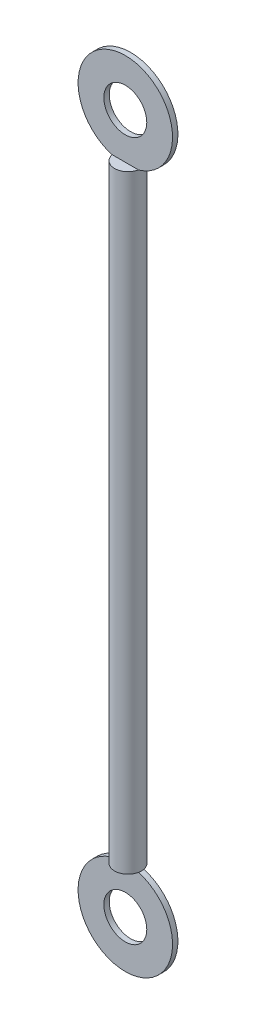
ISO-10303-21;
HEADER;
FILE_DESCRIPTION(('STEP AP214'),'2;1');
FILE_NAME('part.step','',(''),(''),'','','');
FILE_SCHEMA(('AUTOMOTIVE_DESIGN { 1 0 10303 214 1 1 1 1 }'));
ENDSEC;
DATA;
#1=APPLICATION_CONTEXT('core data for automotive mechanical design processes');
#2=APPLICATION_PROTOCOL_DEFINITION('international standard','automotive_design',2000,#1);
#3=PRODUCT_CONTEXT('',#1,'mechanical');
#4=PRODUCT('Part','Part','',(#3));
#5=PRODUCT_RELATED_PRODUCT_CATEGORY('part','',(#4));
#6=PRODUCT_DEFINITION_FORMATION('','',#4);
#7=PRODUCT_DEFINITION_CONTEXT('part definition',#1,'design');
#8=PRODUCT_DEFINITION('design','',#6,#7);
#9=PRODUCT_DEFINITION_SHAPE('','',#8);
#10=(LENGTH_UNIT() NAMED_UNIT(*) SI_UNIT(.MILLI.,.METRE.));
#11=(NAMED_UNIT(*) PLANE_ANGLE_UNIT() SI_UNIT($,.RADIAN.));
#12=(NAMED_UNIT(*) SI_UNIT($,.STERADIAN.) SOLID_ANGLE_UNIT());
#13=UNCERTAINTY_MEASURE_WITH_UNIT(LENGTH_MEASURE(1.E-05),#10,'distance_accuracy_value','');
#14=(GEOMETRIC_REPRESENTATION_CONTEXT(3) GLOBAL_UNCERTAINTY_ASSIGNED_CONTEXT((#13)) GLOBAL_UNIT_ASSIGNED_CONTEXT((#10,
#11,#12)) REPRESENTATION_CONTEXT('',''));
#15=CARTESIAN_POINT('',(0.,0.,0.));
#16=DIRECTION('',(0.,0.,1.));
#17=DIRECTION('',(1.,0.,0.));
#18=AXIS2_PLACEMENT_3D('',#15,#16,#17);
#19=CARTESIAN_POINT('',(0.,296.80693739286,0.));
#20=DIRECTION('',(0.,1.,0.));
#21=DIRECTION('',(-1.,0.,0.));
#22=AXIS2_PLACEMENT_3D('',#19,#20,#21);
#23=PLANE('',#22);
#24=CARTESIAN_POINT('',(0.,296.80693739286,0.));
#25=DIRECTION('',(0.,1.,0.));
#26=DIRECTION('',(-1.,0.,0.));
#27=AXIS2_PLACEMENT_3D('',#24,#25,#26);
#28=CIRCLE('',#27,3.96874999999997);
#29=CARTESIAN_POINT('',(3.88856496666831,296.80693739286,-0.79375));
#30=VERTEX_POINT('',#29);
#31=CARTESIAN_POINT('',(-3.88856496666822,296.80693739286,-0.79375));
#32=VERTEX_POINT('',#31);
#33=EDGE_CURVE('E193',#30,#32,#28,.T.);
#34=ORIENTED_EDGE('',*,*,#33,.T.);
#35=DIRECTION('',(1.,0.,0.));
#36=VECTOR('',#35,1.);
#37=CARTESIAN_POINT('',(0.,296.80693739286,-0.79375));
#38=LINE('',#37,#36);
#39=EDGE_CURVE('E45',#32,#30,#38,.T.);
#40=ORIENTED_EDGE('',*,*,#39,.T.);
#41=EDGE_LOOP('',(#34,#40));
#42=FACE_BOUND('',#41,.T.);
#43=ADVANCED_FACE('F37',(#42),#23,.T.);
#44=CARTESIAN_POINT('',(0.,116.79484440786,0.));
#45=DIRECTION('',(0.,1.,0.));
#46=DIRECTION('',(-1.,0.,0.));
#47=AXIS2_PLACEMENT_3D('',#44,#45,#46);
#48=PLANE('',#47);
#49=DIRECTION('',(1.,0.,0.));
#50=VECTOR('',#49,1.);
#51=CARTESIAN_POINT('',(0.,116.79484440786,-0.79375));
#52=LINE('',#51,#50);
#53=CARTESIAN_POINT('',(-3.88856496666823,116.79484440786,-0.79375));
#54=VERTEX_POINT('',#53);
#55=CARTESIAN_POINT('',(3.88856496666831,116.79484440786,-0.79375));
#56=VERTEX_POINT('',#55);
#57=EDGE_CURVE('E172',#54,#56,#52,.T.);
#58=ORIENTED_EDGE('',*,*,#57,.F.);
#59=CARTESIAN_POINT('',(0.,116.79484440786,0.));
#60=DIRECTION('',(0.,1.,0.));
#61=DIRECTION('',(-1.,0.,0.));
#62=AXIS2_PLACEMENT_3D('',#59,#60,#61);
#63=CIRCLE('',#62,3.96874999999998);
#64=EDGE_CURVE('E271',#56,#54,#63,.T.);
#65=ORIENTED_EDGE('',*,*,#64,.F.);
#66=EDGE_LOOP('',(#58,#65));
#67=FACE_BOUND('',#66,.T.);
#68=ADVANCED_FACE('F222',(#67),#48,.F.);
#69=CARTESIAN_POINT('',(-3.88856496666823,116.79484440786,0.79375));
#70=VERTEX_POINT('',#69);
#71=CARTESIAN_POINT('',(3.88856496666831,116.79484440786,0.79375));
#72=VERTEX_POINT('',#71);
#73=EDGE_CURVE('E188',#70,#72,#63,.T.);
#74=ORIENTED_EDGE('',*,*,#73,.F.);
#75=DIRECTION('',(1.,0.,0.));
#76=VECTOR('',#75,1.);
#77=CARTESIAN_POINT('',(0.,116.79484440786,0.79375));
#78=LINE('',#77,#76);
#79=EDGE_CURVE('E162',#70,#72,#78,.T.);
#80=ORIENTED_EDGE('',*,*,#79,.T.);
#81=EDGE_LOOP('',(#74,#80));
#82=FACE_BOUND('',#81,.T.);
#83=ADVANCED_FACE('F39',(#82),#48,.F.);
#84=CARTESIAN_POINT('',(0.,296.80693739286,0.));
#85=DIRECTION('',(0.,1.,0.));
#86=DIRECTION('',(-1.,0.,0.));
#87=AXIS2_PLACEMENT_3D('',#84,#85,#86);
#88=CYLINDRICAL_SURFACE('',#87,3.96874999999998);
#89=CARTESIAN_POINT('',(-3.96874999999998,296.80693739286,0.));
#90=VERTEX_POINT('',#89);
#91=CARTESIAN_POINT('',(-3.88856496666822,296.80693739286,0.79375));
#92=VERTEX_POINT('',#91);
#93=EDGE_CURVE('E131',#90,#92,#28,.T.);
#94=ORIENTED_EDGE('',*,*,#93,.F.);
#95=EDGE_CURVE('E182',#32,#90,#28,.T.);
#96=ORIENTED_EDGE('',*,*,#95,.F.);
#97=ORIENTED_EDGE('',*,*,#33,.F.);
#98=CARTESIAN_POINT('',(3.96875000000002,296.80693739286,0.));
#99=VERTEX_POINT('',#98);
#100=EDGE_CURVE('E201',#99,#30,#28,.T.);
#101=ORIENTED_EDGE('',*,*,#100,.F.);
#102=CARTESIAN_POINT('',(3.88856496666831,296.80693739286,0.79375));
#103=VERTEX_POINT('',#102);
#104=EDGE_CURVE('E202',#103,#99,#28,.T.);
#105=ORIENTED_EDGE('',*,*,#104,.F.);
#106=EDGE_CURVE('E185',#92,#103,#28,.T.);
#107=ORIENTED_EDGE('',*,*,#106,.F.);
#108=EDGE_LOOP('',(#94,#96,#97,#101,#105,#107));
#109=FACE_BOUND('',#108,.T.);
#110=CARTESIAN_POINT('',(-3.96874999999998,116.79484440786,0.));
#111=VERTEX_POINT('',#110);
#112=EDGE_CURVE('E186',#111,#70,#63,.T.);
#113=ORIENTED_EDGE('',*,*,#112,.T.);
#114=ORIENTED_EDGE('',*,*,#73,.T.);
#115=CARTESIAN_POINT('',(3.96875000000002,116.79484440786,0.));
#116=VERTEX_POINT('',#115);
#117=EDGE_CURVE('E253',#72,#116,#63,.T.);
#118=ORIENTED_EDGE('',*,*,#117,.T.);
#119=EDGE_CURVE('E270',#116,#56,#63,.T.);
#120=ORIENTED_EDGE('',*,*,#119,.T.);
#121=ORIENTED_EDGE('',*,*,#64,.T.);
#122=EDGE_CURVE('E184',#54,#111,#63,.T.);
#123=ORIENTED_EDGE('',*,*,#122,.T.);
#124=EDGE_LOOP('',(#113,#114,#118,#120,#121,#123));
#125=FACE_BOUND('',#124,.T.);
#126=ADVANCED_FACE('F198',(#109,#125),#88,.T.);
#127=DIRECTION('',(1.,0.,0.));
#128=VECTOR('',#127,1.);
#129=CARTESIAN_POINT('',(0.,296.80693739286,0.79375));
#130=LINE('',#129,#128);
#131=EDGE_CURVE('E11',#92,#103,#130,.T.);
#132=ORIENTED_EDGE('',*,*,#131,.F.);
#133=ORIENTED_EDGE('',*,*,#106,.T.);
#134=EDGE_LOOP('',(#132,#133));
#135=FACE_BOUND('',#134,.T.);
#136=ADVANCED_FACE('F224',(#135),#23,.T.);
#137=CARTESIAN_POINT('',(0.,116.79484440786,0.79375));
#138=DIRECTION('',(0.,1.,0.));
#139=DIRECTION('',(0.,0.,1.));
#140=AXIS2_PLACEMENT_3D('',#137,#138,#139);
#141=PLANE('',#140);
#142=ORIENTED_EDGE('',*,*,#117,.F.);
#143=CARTESIAN_POINT('',(3.96875000000002,116.79484440786,0.79375));
#144=VERTEX_POINT('',#143);
#145=EDGE_CURVE('E158',#72,#144,#78,.T.);
#146=ORIENTED_EDGE('',*,*,#145,.T.);
#147=DIRECTION('',(0.,0.,-1.));
#148=VECTOR('',#147,1.);
#149=CARTESIAN_POINT('',(3.96875000000002,116.79484440786,0.79375));
#150=LINE('',#149,#148);
#151=EDGE_CURVE('E175',#144,#116,#150,.T.);
#152=ORIENTED_EDGE('',*,*,#151,.T.);
#153=EDGE_LOOP('',(#142,#146,#152));
#154=FACE_BOUND('',#153,.T.);
#155=ADVANCED_FACE('F231',(#154),#141,.T.);
#156=ORIENTED_EDGE('',*,*,#119,.F.);
#157=CARTESIAN_POINT('',(3.96875000000002,116.79484440786,-0.79375));
#158=VERTEX_POINT('',#157);
#159=EDGE_CURVE('E165',#116,#158,#150,.T.);
#160=ORIENTED_EDGE('',*,*,#159,.T.);
#161=EDGE_CURVE('E168',#56,#158,#52,.T.);
#162=ORIENTED_EDGE('',*,*,#161,.F.);
#163=EDGE_LOOP('',(#156,#160,#162));
#164=FACE_BOUND('',#163,.T.);
#165=ADVANCED_FACE('F237',(#164),#141,.T.);
#166=ORIENTED_EDGE('',*,*,#122,.F.);
#167=CARTESIAN_POINT('',(-3.96874999999998,116.79484440786,-0.79375));
#168=VERTEX_POINT('',#167);
#169=EDGE_CURVE('E169',#168,#54,#52,.T.);
#170=ORIENTED_EDGE('',*,*,#169,.F.);
#171=DIRECTION('',(0.,0.,-1.));
#172=VECTOR('',#171,1.);
#173=CARTESIAN_POINT('',(-3.96874999999998,116.79484440786,0.79375));
#174=LINE('',#173,#172);
#175=EDGE_CURVE('E178',#111,#168,#174,.T.);
#176=ORIENTED_EDGE('',*,*,#175,.F.);
#177=EDGE_LOOP('',(#166,#170,#176));
#178=FACE_BOUND('',#177,.T.);
#179=ADVANCED_FACE('F260',(#178),#141,.T.);
#180=ORIENTED_EDGE('',*,*,#112,.F.);
#181=CARTESIAN_POINT('',(-3.96874999999998,116.79484440786,0.79375));
#182=VERTEX_POINT('',#181);
#183=EDGE_CURVE('E179',#182,#111,#174,.T.);
#184=ORIENTED_EDGE('',*,*,#183,.F.);
#185=EDGE_CURVE('E60',#182,#70,#78,.T.);
#186=ORIENTED_EDGE('',*,*,#185,.T.);
#187=EDGE_LOOP('',(#180,#184,#186));
#188=FACE_BOUND('',#187,.T.);
#189=ADVANCED_FACE('F240',(#188),#141,.T.);
#190=CARTESIAN_POINT('',(0.,103.40044545018,0.79375));
#191=DIRECTION('',(0.,0.,-1.));
#192=DIRECTION('',(-1.,0.,0.));
#193=AXIS2_PLACEMENT_3D('',#190,#191,#192);
#194=CYLINDRICAL_SURFACE('',#193,6.35);
#195=CARTESIAN_POINT('',(0.,103.40044545018,0.79375));
#196=DIRECTION('',(0.,0.,1.));
#197=DIRECTION('',(1.,0.,0.));
#198=AXIS2_PLACEMENT_3D('',#195,#196,#197);
#199=CIRCLE('',#198,6.35);
#200=CARTESIAN_POINT('',(6.35000000000002,103.40044545018,0.79375));
#201=VERTEX_POINT('',#200);
#202=EDGE_CURVE('E155',#201,#201,#199,.T.);
#203=ORIENTED_EDGE('',*,*,#202,.T.);
#204=EDGE_LOOP('',(#203));
#205=FACE_BOUND('',#204,.T.);
#206=CARTESIAN_POINT('',(0.,103.40044545018,-0.79375));
#207=DIRECTION('',(0.,0.,1.));
#208=DIRECTION('',(1.,0.,0.));
#209=AXIS2_PLACEMENT_3D('',#206,#207,#208);
#210=CIRCLE('',#209,6.35);
#211=CARTESIAN_POINT('',(6.35000000000002,103.40044545018,-0.79375));
#212=VERTEX_POINT('',#211);
#213=EDGE_CURVE('E126',#212,#212,#210,.T.);
#214=ORIENTED_EDGE('',*,*,#213,.F.);
#215=EDGE_LOOP('',(#214));
#216=FACE_BOUND('',#215,.T.);
#217=ADVANCED_FACE('F284',(#205,#216),#194,.F.);
#218=CARTESIAN_POINT('',(0.,103.40044545018,0.79375));
#219=DIRECTION('',(0.,0.,-1.));
#220=DIRECTION('',(-1.,0.,0.));
#221=AXIS2_PLACEMENT_3D('',#218,#219,#220);
#222=CYLINDRICAL_SURFACE('',#221,13.97);
#223=CARTESIAN_POINT('',(0.,103.40044545018,-0.79375));
#224=DIRECTION('',(0.,0.,1.));
#225=DIRECTION('',(1.,0.,0.));
#226=AXIS2_PLACEMENT_3D('',#223,#224,#225);
#227=CIRCLE('',#226,13.97);
#228=EDGE_CURVE('E159',#168,#158,#227,.T.);
#229=ORIENTED_EDGE('',*,*,#228,.T.);
#230=ORIENTED_EDGE('',*,*,#159,.F.);
#231=ORIENTED_EDGE('',*,*,#151,.F.);
#232=CARTESIAN_POINT('',(0.,103.40044545018,0.79375));
#233=DIRECTION('',(0.,0.,1.));
#234=DIRECTION('',(1.,0.,0.));
#235=AXIS2_PLACEMENT_3D('',#232,#233,#234);
#236=CIRCLE('',#235,13.97);
#237=EDGE_CURVE('E161',#182,#144,#236,.T.);
#238=ORIENTED_EDGE('',*,*,#237,.F.);
#239=ORIENTED_EDGE('',*,*,#183,.T.);
#240=ORIENTED_EDGE('',*,*,#175,.T.);
#241=EDGE_LOOP('',(#229,#230,#231,#238,#239,#240));
#242=FACE_BOUND('',#241,.T.);
#243=ADVANCED_FACE('F263',(#242),#222,.T.);
#244=CARTESIAN_POINT('',(0.,103.40044545018,0.79375));
#245=DIRECTION('',(0.,0.,1.));
#246=DIRECTION('',(1.,0.,0.));
#247=AXIS2_PLACEMENT_3D('',#244,#245,#246);
#248=PLANE('',#247);
#249=ORIENTED_EDGE('',*,*,#202,.F.);
#250=EDGE_LOOP('',(#249));
#251=FACE_BOUND('',#250,.T.);
#252=ORIENTED_EDGE('',*,*,#185,.F.);
#253=ORIENTED_EDGE('',*,*,#237,.T.);
#254=ORIENTED_EDGE('',*,*,#145,.F.);
#255=ORIENTED_EDGE('',*,*,#79,.F.);
#256=EDGE_LOOP('',(#252,#253,#254,#255));
#257=FACE_BOUND('',#256,.T.);
#258=ADVANCED_FACE('F268',(#251,#257),#248,.T.);
#259=CARTESIAN_POINT('',(0.,103.40044545018,-0.79375));
#260=DIRECTION('',(0.,0.,1.));
#261=DIRECTION('',(1.,0.,0.));
#262=AXIS2_PLACEMENT_3D('',#259,#260,#261);
#263=PLANE('',#262);
#264=ORIENTED_EDGE('',*,*,#213,.T.);
#265=EDGE_LOOP('',(#264));
#266=FACE_BOUND('',#265,.T.);
#267=ORIENTED_EDGE('',*,*,#169,.T.);
#268=ORIENTED_EDGE('',*,*,#57,.T.);
#269=ORIENTED_EDGE('',*,*,#161,.T.);
#270=ORIENTED_EDGE('',*,*,#228,.F.);
#271=EDGE_LOOP('',(#267,#268,#269,#270));
#272=FACE_BOUND('',#271,.T.);
#273=ADVANCED_FACE('F217',(#266,#272),#263,.F.);
#274=CARTESIAN_POINT('',(0.,296.80693739286,0.79375));
#275=DIRECTION('',(0.,1.,0.));
#276=DIRECTION('',(0.,0.,1.));
#277=AXIS2_PLACEMENT_3D('',#274,#275,#276);
#278=PLANE('',#277);
#279=DIRECTION('',(1.,0.,0.));
#280=VECTOR('',#279,1.);
#281=CARTESIAN_POINT('',(0.,296.80693739286,0.79375));
#282=LINE('',#281,#280);
#283=CARTESIAN_POINT('',(3.96875000000002,296.80693739286,0.79375));
#284=VERTEX_POINT('',#283);
#285=EDGE_CURVE('E135',#103,#284,#282,.T.);
#286=ORIENTED_EDGE('',*,*,#285,.F.);
#287=ORIENTED_EDGE('',*,*,#104,.T.);
#288=DIRECTION('',(0.,0.,-1.));
#289=VECTOR('',#288,1.);
#290=CARTESIAN_POINT('',(3.96875000000002,296.80693739286,0.79375));
#291=LINE('',#290,#289);
#292=EDGE_CURVE('E153',#284,#99,#291,.T.);
#293=ORIENTED_EDGE('',*,*,#292,.F.);
#294=EDGE_LOOP('',(#286,#287,#293));
#295=FACE_BOUND('',#294,.T.);
#296=ADVANCED_FACE('F211',(#295),#278,.F.);
#297=CARTESIAN_POINT('',(3.96875000000002,296.80693739286,-0.79375));
#298=VERTEX_POINT('',#297);
#299=EDGE_CURVE('E148',#99,#298,#291,.T.);
#300=ORIENTED_EDGE('',*,*,#299,.F.);
#301=ORIENTED_EDGE('',*,*,#100,.T.);
#302=DIRECTION('',(1.,0.,0.));
#303=VECTOR('',#302,1.);
#304=CARTESIAN_POINT('',(0.,296.80693739286,-0.79375));
#305=LINE('',#304,#303);
#306=EDGE_CURVE('E52',#30,#298,#305,.T.);
#307=ORIENTED_EDGE('',*,*,#306,.T.);
#308=EDGE_LOOP('',(#300,#301,#307));
#309=FACE_BOUND('',#308,.T.);
#310=ADVANCED_FACE('F209',(#309),#278,.F.);
#311=CARTESIAN_POINT('',(-3.96874999999998,296.80693739286,-0.79375));
#312=VERTEX_POINT('',#311);
#313=EDGE_CURVE('E143',#312,#32,#305,.T.);
#314=ORIENTED_EDGE('',*,*,#313,.T.);
#315=ORIENTED_EDGE('',*,*,#95,.T.);
#316=DIRECTION('',(0.,0.,-1.));
#317=VECTOR('',#316,1.);
#318=CARTESIAN_POINT('',(-3.96874999999998,296.80693739286,0.79375));
#319=LINE('',#318,#317);
#320=EDGE_CURVE('E123',#90,#312,#319,.T.);
#321=ORIENTED_EDGE('',*,*,#320,.T.);
#322=EDGE_LOOP('',(#314,#315,#321));
#323=FACE_BOUND('',#322,.T.);
#324=ADVANCED_FACE('F204',(#323),#278,.F.);
#325=CARTESIAN_POINT('',(0.,310.20133635054,0.79375));
#326=DIRECTION('',(0.,0.,-1.));
#327=DIRECTION('',(-1.,0.,0.));
#328=AXIS2_PLACEMENT_3D('',#325,#326,#327);
#329=CYLINDRICAL_SURFACE('',#328,13.97);
#330=CARTESIAN_POINT('',(0.,310.20133635054,-0.79375));
#331=DIRECTION('',(0.,0.,1.));
#332=DIRECTION('',(1.,0.,0.));
#333=AXIS2_PLACEMENT_3D('',#330,#331,#332);
#334=CIRCLE('',#333,13.97);
#335=EDGE_CURVE('E149',#312,#298,#334,.F.);
#336=ORIENTED_EDGE('',*,*,#335,.F.);
#337=ORIENTED_EDGE('',*,*,#320,.F.);
#338=CARTESIAN_POINT('',(-3.96874999999998,296.80693739286,0.79375));
#339=VERTEX_POINT('',#338);
#340=EDGE_CURVE('E116',#339,#90,#319,.T.);
#341=ORIENTED_EDGE('',*,*,#340,.F.);
#342=CARTESIAN_POINT('',(0.,310.20133635054,0.79375));
#343=DIRECTION('',(0.,0.,1.));
#344=DIRECTION('',(1.,0.,0.));
#345=AXIS2_PLACEMENT_3D('',#342,#343,#344);
#346=CIRCLE('',#345,13.97);
#347=EDGE_CURVE('E122',#339,#284,#346,.F.);
#348=ORIENTED_EDGE('',*,*,#347,.T.);
#349=ORIENTED_EDGE('',*,*,#292,.T.);
#350=ORIENTED_EDGE('',*,*,#299,.T.);
#351=EDGE_LOOP('',(#336,#337,#341,#348,#349,#350));
#352=FACE_BOUND('',#351,.T.);
#353=ADVANCED_FACE('F119',(#352),#329,.T.);
#354=ORIENTED_EDGE('',*,*,#340,.T.);
#355=ORIENTED_EDGE('',*,*,#93,.T.);
#356=EDGE_CURVE('E129',#339,#92,#282,.T.);
#357=ORIENTED_EDGE('',*,*,#356,.F.);
#358=EDGE_LOOP('',(#354,#355,#357));
#359=FACE_BOUND('',#358,.T.);
#360=ADVANCED_FACE('F130',(#359),#278,.F.);
#361=CARTESIAN_POINT('',(0.,310.20133635054,0.79375));
#362=DIRECTION('',(0.,0.,-1.));
#363=DIRECTION('',(-1.,0.,0.));
#364=AXIS2_PLACEMENT_3D('',#361,#362,#363);
#365=CYLINDRICAL_SURFACE('',#364,6.35);
#366=CARTESIAN_POINT('',(0.,310.20133635054,0.79375));
#367=DIRECTION('',(0.,0.,1.));
#368=DIRECTION('',(1.,0.,0.));
#369=AXIS2_PLACEMENT_3D('',#366,#367,#368);
#370=CIRCLE('',#369,6.35);
#371=CARTESIAN_POINT('',(6.35000000000002,310.20133635054,0.79375));
#372=VERTEX_POINT('',#371);
#373=EDGE_CURVE('E134',#372,#372,#370,.F.);
#374=ORIENTED_EDGE('',*,*,#373,.F.);
#375=EDGE_LOOP('',(#374));
#376=FACE_BOUND('',#375,.T.);
#377=CARTESIAN_POINT('',(0.,310.20133635054,-0.79375));
#378=DIRECTION('',(0.,0.,1.));
#379=DIRECTION('',(1.,0.,0.));
#380=AXIS2_PLACEMENT_3D('',#377,#378,#379);
#381=CIRCLE('',#380,6.35);
#382=CARTESIAN_POINT('',(6.35000000000002,310.20133635054,-0.79375));
#383=VERTEX_POINT('',#382);
#384=EDGE_CURVE('E140',#383,#383,#381,.F.);
#385=ORIENTED_EDGE('',*,*,#384,.T.);
#386=EDGE_LOOP('',(#385));
#387=FACE_BOUND('',#386,.T.);
#388=ADVANCED_FACE('F305',(#376,#387),#365,.F.);
#389=CARTESIAN_POINT('',(0.,103.40044545018,0.79375));
#390=DIRECTION('',(0.,0.,1.));
#391=DIRECTION('',(1.,0.,0.));
#392=AXIS2_PLACEMENT_3D('',#389,#390,#391);
#393=PLANE('',#392);
#394=ORIENTED_EDGE('',*,*,#347,.F.);
#395=ORIENTED_EDGE('',*,*,#356,.T.);
#396=ORIENTED_EDGE('',*,*,#131,.T.);
#397=ORIENTED_EDGE('',*,*,#285,.T.);
#398=EDGE_LOOP('',(#394,#395,#396,#397));
#399=FACE_BOUND('',#398,.T.);
#400=ORIENTED_EDGE('',*,*,#373,.T.);
#401=EDGE_LOOP('',(#400));
#402=FACE_BOUND('',#401,.T.);
#403=ADVANCED_FACE('F137',(#399,#402),#393,.T.);
#404=CARTESIAN_POINT('',(0.,103.40044545018,-0.79375));
#405=DIRECTION('',(0.,0.,1.));
#406=DIRECTION('',(1.,0.,0.));
#407=AXIS2_PLACEMENT_3D('',#404,#405,#406);
#408=PLANE('',#407);
#409=ORIENTED_EDGE('',*,*,#335,.T.);
#410=ORIENTED_EDGE('',*,*,#306,.F.);
#411=ORIENTED_EDGE('',*,*,#39,.F.);
#412=ORIENTED_EDGE('',*,*,#313,.F.);
#413=EDGE_LOOP('',(#409,#410,#411,#412));
#414=FACE_BOUND('',#413,.T.);
#415=ORIENTED_EDGE('',*,*,#384,.F.);
#416=EDGE_LOOP('',(#415));
#417=FACE_BOUND('',#416,.T.);
#418=ADVANCED_FACE('F205',(#414,#417),#408,.F.);
#419=CLOSED_SHELL('',(#43,#68,#83,#126,#136,#155,#165,#179,#189,#217,#243,#258,#273,#296,#310,
#324,#353,#360,#388,#403,#418));
#420=MANIFOLD_SOLID_BREP('B2',#419);
#421=ADVANCED_BREP_SHAPE_REPRESENTATION('',(#18,#420),#14);
#422=SHAPE_DEFINITION_REPRESENTATION(#9,#421);
ENDSEC;
END-ISO-10303-21;
